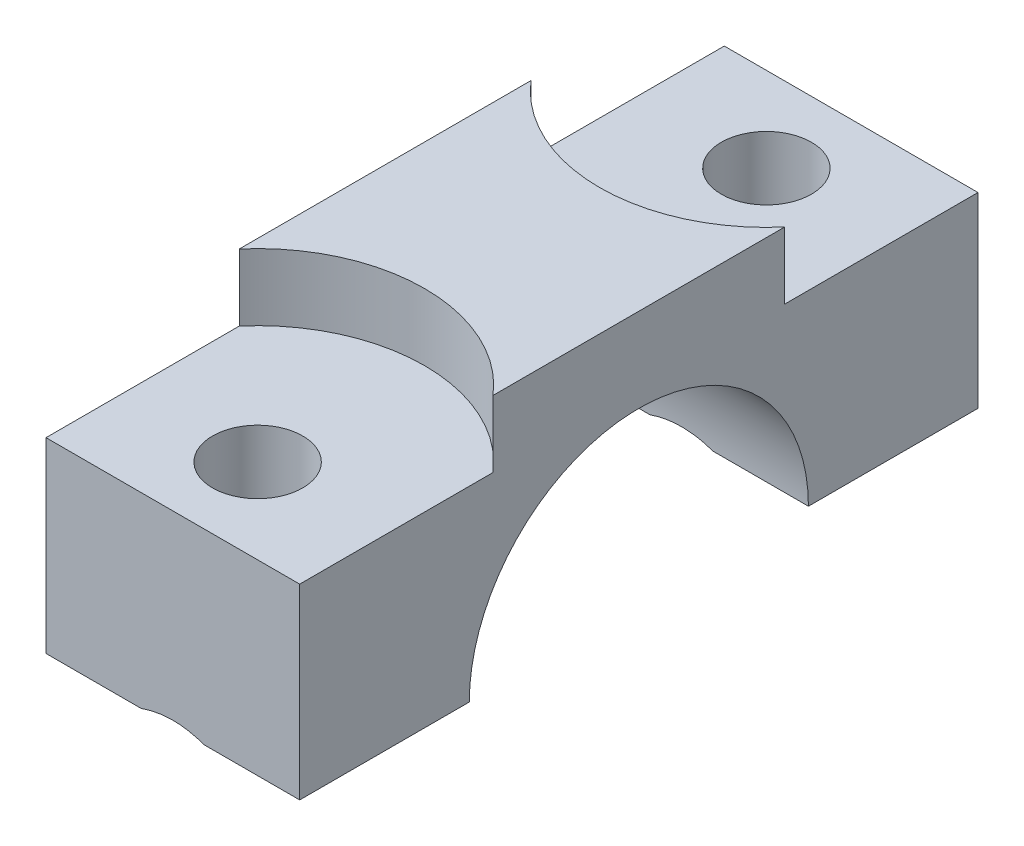
ISO-10303-21;
HEADER;
FILE_DESCRIPTION(('STEP AP214'),'2;1');
FILE_NAME('part.step','',(''),(''),'','','');
FILE_SCHEMA(('AUTOMOTIVE_DESIGN { 1 0 10303 214 1 1 1 1 }'));
ENDSEC;
DATA;
#1=APPLICATION_CONTEXT('core data for automotive mechanical design processes');
#2=APPLICATION_PROTOCOL_DEFINITION('international standard','automotive_design',2000,#1);
#3=PRODUCT_CONTEXT('',#1,'mechanical');
#4=PRODUCT('Part','Part','',(#3));
#5=PRODUCT_RELATED_PRODUCT_CATEGORY('part','',(#4));
#6=PRODUCT_DEFINITION_FORMATION('','',#4);
#7=PRODUCT_DEFINITION_CONTEXT('part definition',#1,'design');
#8=PRODUCT_DEFINITION('design','',#6,#7);
#9=PRODUCT_DEFINITION_SHAPE('','',#8);
#10=(LENGTH_UNIT() NAMED_UNIT(*) SI_UNIT(.MILLI.,.METRE.));
#11=(NAMED_UNIT(*) PLANE_ANGLE_UNIT() SI_UNIT($,.RADIAN.));
#12=(NAMED_UNIT(*) SI_UNIT($,.STERADIAN.) SOLID_ANGLE_UNIT());
#13=UNCERTAINTY_MEASURE_WITH_UNIT(LENGTH_MEASURE(1.E-05),#10,'distance_accuracy_value','');
#14=(GEOMETRIC_REPRESENTATION_CONTEXT(3) GLOBAL_UNCERTAINTY_ASSIGNED_CONTEXT((#13)) GLOBAL_UNIT_ASSIGNED_CONTEXT((#10,
#11,#12)) REPRESENTATION_CONTEXT('',''));
#15=CARTESIAN_POINT('',(0.,0.,0.));
#16=DIRECTION('',(0.,0.,1.));
#17=DIRECTION('',(1.,0.,0.));
#18=AXIS2_PLACEMENT_3D('',#15,#16,#17);
#19=CARTESIAN_POINT('',(9.5,0.,0.));
#20=DIRECTION('',(0.,1.,0.));
#21=DIRECTION('',(0.,0.,1.));
#22=AXIS2_PLACEMENT_3D('',#19,#20,#21);
#23=PLANE('',#22);
#24=DIRECTION('',(-1.,0.,0.));
#25=VECTOR('',#24,1.);
#26=CARTESIAN_POINT('',(9.5,0.,-12.7));
#27=LINE('',#26,#25);
#28=CARTESIAN_POINT('',(9.5,0.,-12.7));
#29=VERTEX_POINT('',#28);
#30=CARTESIAN_POINT('',(2.36180545346139,0.,-12.7));
#31=VERTEX_POINT('',#30);
#32=EDGE_CURVE('E235',#29,#31,#27,.T.);
#33=ORIENTED_EDGE('',*,*,#32,.T.);
#34=CARTESIAN_POINT('',(0.,0.,-19.05));
#35=DIRECTION('',(0.,1.,0.));
#36=DIRECTION('',(0.,0.,1.));
#37=AXIS2_PLACEMENT_3D('',#34,#35,#36);
#38=CIRCLE('',#37,6.775);
#39=CARTESIAN_POINT('',(2.36180545346138,0.,-25.4));
#40=VERTEX_POINT('',#39);
#41=EDGE_CURVE('E337',#31,#40,#38,.T.);
#42=ORIENTED_EDGE('',*,*,#41,.T.);
#43=DIRECTION('',(-1.,0.,0.));
#44=VECTOR('',#43,1.);
#45=CARTESIAN_POINT('',(9.5,0.,-25.4));
#46=LINE('',#45,#44);
#47=CARTESIAN_POINT('',(9.5,0.,-25.4));
#48=VERTEX_POINT('',#47);
#49=EDGE_CURVE('E231',#48,#40,#46,.T.);
#50=ORIENTED_EDGE('',*,*,#49,.F.);
#51=DIRECTION('',(0.,0.,-1.));
#52=VECTOR('',#51,1.);
#53=CARTESIAN_POINT('',(9.5,0.,0.));
#54=LINE('',#53,#52);
#55=EDGE_CURVE('E199',#29,#48,#54,.T.);
#56=ORIENTED_EDGE('',*,*,#55,.F.);
#57=EDGE_LOOP('',(#33,#42,#50,#56));
#58=FACE_BOUND('',#57,.T.);
#59=ADVANCED_FACE('F33',(#58),#23,.F.);
#60=DIRECTION('',(-1.,0.,0.));
#61=VECTOR('',#60,1.);
#62=CARTESIAN_POINT('',(9.5,0.,25.4));
#63=LINE('',#62,#61);
#64=CARTESIAN_POINT('',(9.5,0.,25.4));
#65=VERTEX_POINT('',#64);
#66=CARTESIAN_POINT('',(2.3618054534614,0.,25.4));
#67=VERTEX_POINT('',#66);
#68=EDGE_CURVE('E227',#65,#67,#63,.T.);
#69=ORIENTED_EDGE('',*,*,#68,.T.);
#70=CARTESIAN_POINT('',(0.,0.,19.05));
#71=DIRECTION('',(0.,1.,0.));
#72=DIRECTION('',(0.,0.,1.));
#73=AXIS2_PLACEMENT_3D('',#70,#71,#72);
#74=CIRCLE('',#73,6.775);
#75=CARTESIAN_POINT('',(2.36180545346139,0.,12.7));
#76=VERTEX_POINT('',#75);
#77=EDGE_CURVE('E269',#67,#76,#74,.T.);
#78=ORIENTED_EDGE('',*,*,#77,.T.);
#79=DIRECTION('',(-1.,0.,0.));
#80=VECTOR('',#79,1.);
#81=CARTESIAN_POINT('',(9.5,0.,12.7));
#82=LINE('',#81,#80);
#83=CARTESIAN_POINT('',(9.5,0.,12.7));
#84=VERTEX_POINT('',#83);
#85=EDGE_CURVE('E222',#84,#76,#82,.T.);
#86=ORIENTED_EDGE('',*,*,#85,.F.);
#87=EDGE_CURVE('E202',#65,#84,#54,.T.);
#88=ORIENTED_EDGE('',*,*,#87,.F.);
#89=EDGE_LOOP('',(#69,#78,#86,#88));
#90=FACE_BOUND('',#89,.T.);
#91=ADVANCED_FACE('F297',(#90),#23,.F.);
#92=CARTESIAN_POINT('',(9.5,0.,0.));
#93=DIRECTION('',(-1.,0.,0.));
#94=DIRECTION('',(0.,0.,1.));
#95=AXIS2_PLACEMENT_3D('',#92,#93,#94);
#96=CYLINDRICAL_SURFACE('',#95,12.7);
#97=CARTESIAN_POINT('',(3.20088610634259,-0.340199999999996,-12.695442645296));
#98=CARTESIAN_POINT('',(2.98760367423764,-0.241873493435762,-12.6980814298224));
#99=CARTESIAN_POINT('',(2.77075334441911,-0.150734277663432,-12.6993732807779));
#100=CARTESIAN_POINT('',(2.33001667964961,0.0143484953978662,-12.7002605537787));
#101=CARTESIAN_POINT('',(2.1061141253969,0.0882485395777557,-12.6998517310824));
#102=CARTESIAN_POINT('',(1.6540447186778,0.215061497088232,-12.6983372365348));
#103=CARTESIAN_POINT('',(1.42591908954484,0.26811878135838,-12.6972365007729));
#104=CARTESIAN_POINT('',(0.965686859090227,0.351233023819484,-12.6952112601035));
#105=CARTESIAN_POINT('',(0.733584442182601,0.381312801883203,-12.6942865810343));
#106=CARTESIAN_POINT('',(0.2769775563334,0.41606829770035,-12.6931942628909));
#107=CARTESIAN_POINT('',(0.0525488971303182,0.421729292811496,-12.6929973095901));
#108=CARTESIAN_POINT('',(-0.395770159041613,0.410016895435441,-12.6933808936333));
#109=CARTESIAN_POINT('',(-0.619660364442378,0.392636255146701,-12.6939616756164));
#110=CARTESIAN_POINT('',(-1.06450974648838,0.335822541414968,-12.6955902659321));
#111=CARTESIAN_POINT('',(-1.28546975710559,0.296395886716365,-12.6966379383105));
#112=CARTESIAN_POINT('',(-1.72275436294014,0.197516578643697,-12.6985594524727));
#113=CARTESIAN_POINT('',(-1.93908007376723,0.13806880388185,-12.6994333365216));
#114=CARTESIAN_POINT('',(-2.33169605142416,0.0126854476301309,-12.7001217882707));
#115=CARTESIAN_POINT('',(-2.50882664672544,-0.0506663829319185,-12.7000842013808));
#116=CARTESIAN_POINT('',(-2.85832472522239,-0.187907663557629,-12.6987953478512));
#117=CARTESIAN_POINT('',(-3.0307054252539,-0.261763379600662,-12.6975478948979));
#118=CARTESIAN_POINT('',(-3.20088610634259,-0.340199999999996,-12.695442645296));
#119=B_SPLINE_CURVE_WITH_KNOTS('',3,(#97,#98,#99,#100,#101,#102,#103,#104,#105,#106,#107,#108,
#109,#110,#111,#112,#113,#114,#115,#116,#117,#118),.UNSPECIFIED.,.F.,.F.,(4,2,2,2,2,2,2,2,2,2,
4),(0.,0.704801530635854,1.41136324202494,2.11294069334842,2.81382047113446,3.48613905439842,
4.15866916726724,4.83100357343024,5.50317426804884,6.06717090407667,6.62939549359292),.UNSPECIFIED.);
#120=CARTESIAN_POINT('',(-2.36180545346139,0.,-12.7));
#121=VERTEX_POINT('',#120);
#122=EDGE_CURVE('E273',#31,#121,#119,.T.);
#123=ORIENTED_EDGE('',*,*,#122,.F.);
#124=ORIENTED_EDGE('',*,*,#32,.F.);
#125=CARTESIAN_POINT('',(9.5,0.,0.));
#126=DIRECTION('',(1.,0.,0.));
#127=DIRECTION('',(0.,0.,-1.));
#128=AXIS2_PLACEMENT_3D('',#125,#126,#127);
#129=CIRCLE('',#128,12.7);
#130=EDGE_CURVE('E196',#29,#84,#129,.T.);
#131=ORIENTED_EDGE('',*,*,#130,.T.);
#132=ORIENTED_EDGE('',*,*,#85,.T.);
#133=CARTESIAN_POINT('',(-3.2008861063426,-0.340199999999996,12.695442645296));
#134=CARTESIAN_POINT('',(-2.98760367423765,-0.241873493435761,12.6980814298224));
#135=CARTESIAN_POINT('',(-2.77075334441912,-0.15073427766343,12.6993732807779));
#136=CARTESIAN_POINT('',(-2.33001667964962,0.0143484953978683,12.7002605537787));
#137=CARTESIAN_POINT('',(-2.10611412539691,0.0882485395777574,12.6998517310824));
#138=CARTESIAN_POINT('',(-1.6540447186778,0.215061497088235,12.6983372365348));
#139=CARTESIAN_POINT('',(-1.42591908954485,0.268118781358385,12.6972365007729));
#140=CARTESIAN_POINT('',(-0.965686859090232,0.351233023819489,12.6952112601035));
#141=CARTESIAN_POINT('',(-0.733584442182605,0.381312801883207,12.6942865810343));
#142=CARTESIAN_POINT('',(-0.276977556333404,0.416068297700354,12.6931942628909));
#143=CARTESIAN_POINT('',(-0.0525488971303222,0.421729292811501,12.6929973095901));
#144=CARTESIAN_POINT('',(0.395770159041609,0.410016895435447,12.6933808936333));
#145=CARTESIAN_POINT('',(0.619660364442374,0.392636255146706,12.6939616756164));
#146=CARTESIAN_POINT('',(1.06450974648838,0.335822541414974,12.6955902659321));
#147=CARTESIAN_POINT('',(1.28546975710559,0.296395886716372,12.6966379383105));
#148=CARTESIAN_POINT('',(1.72275436294013,0.197516578643703,12.6985594524727));
#149=CARTESIAN_POINT('',(1.93908007376723,0.138068803881855,12.6994333365216));
#150=CARTESIAN_POINT('',(2.33169605142416,0.0126854476301337,12.7001217882707));
#151=CARTESIAN_POINT('',(2.50882664672544,-0.0506663829319159,12.7000842013808));
#152=CARTESIAN_POINT('',(2.85832472522239,-0.187907663557627,12.6987953478512));
#153=CARTESIAN_POINT('',(3.03070542525391,-0.26176337960066,12.6975478948979));
#154=CARTESIAN_POINT('',(3.2008861063426,-0.340199999999995,12.695442645296));
#155=B_SPLINE_CURVE_WITH_KNOTS('',3,(#133,#134,#135,#136,#137,#138,#139,#140,#141,#142,#143,
#144,#145,#146,#147,#148,#149,#150,#151,#152,#153,#154),.UNSPECIFIED.,.F.,.F.,(4,2,2,2,2,2,2,2,
2,2,4),(0.,0.704801530635856,1.41136324202494,2.11294069334843,2.81382047113447,
3.48613905439842,4.15866916726724,4.83100357343025,5.50317426804885,6.06717090407668,
6.62939549359294),.UNSPECIFIED.);
#156=CARTESIAN_POINT('',(-2.36180545346139,0.,12.7));
#157=VERTEX_POINT('',#156);
#158=EDGE_CURVE('E186',#157,#76,#155,.T.);
#159=ORIENTED_EDGE('',*,*,#158,.F.);
#160=CARTESIAN_POINT('',(-9.5,0.,12.7));
#161=VERTEX_POINT('',#160);
#162=EDGE_CURVE('E226',#157,#161,#82,.T.);
#163=ORIENTED_EDGE('',*,*,#162,.T.);
#164=CARTESIAN_POINT('',(-9.5,0.,0.));
#165=DIRECTION('',(1.,0.,0.));
#166=DIRECTION('',(0.,0.,-1.));
#167=AXIS2_PLACEMENT_3D('',#164,#165,#166);
#168=CIRCLE('',#167,12.7);
#169=CARTESIAN_POINT('',(-9.5,0.,-12.7));
#170=VERTEX_POINT('',#169);
#171=EDGE_CURVE('E193',#170,#161,#168,.T.);
#172=ORIENTED_EDGE('',*,*,#171,.F.);
#173=EDGE_CURVE('E234',#121,#170,#27,.T.);
#174=ORIENTED_EDGE('',*,*,#173,.F.);
#175=EDGE_LOOP('',(#123,#124,#131,#132,#159,#163,#172,#174));
#176=FACE_BOUND('',#175,.T.);
#177=ADVANCED_FACE('F35',(#176),#96,.F.);
#178=CARTESIAN_POINT('',(-2.36180545346136,0.,-25.4));
#179=VERTEX_POINT('',#178);
#180=CARTESIAN_POINT('',(-9.5,0.,-25.4));
#181=VERTEX_POINT('',#180);
#182=EDGE_CURVE('E230',#179,#181,#46,.T.);
#183=ORIENTED_EDGE('',*,*,#182,.F.);
#184=EDGE_CURVE('E53',#179,#121,#38,.T.);
#185=ORIENTED_EDGE('',*,*,#184,.T.);
#186=ORIENTED_EDGE('',*,*,#173,.T.);
#187=DIRECTION('',(0.,0.,-1.));
#188=VECTOR('',#187,1.);
#189=CARTESIAN_POINT('',(-9.5,0.,0.));
#190=LINE('',#189,#188);
#191=EDGE_CURVE('E210',#170,#181,#190,.T.);
#192=ORIENTED_EDGE('',*,*,#191,.T.);
#193=EDGE_LOOP('',(#183,#185,#186,#192));
#194=FACE_BOUND('',#193,.T.);
#195=ADVANCED_FACE('F304',(#194),#23,.F.);
#196=CARTESIAN_POINT('',(9.5,0.,-25.4));
#197=DIRECTION('',(0.,0.,-1.));
#198=DIRECTION('',(0.,1.,0.));
#199=AXIS2_PLACEMENT_3D('',#196,#197,#198);
#200=PLANE('',#199);
#201=DIRECTION('',(-1.,0.,0.));
#202=VECTOR('',#201,1.);
#203=CARTESIAN_POINT('',(9.5,14.,-25.4));
#204=LINE('',#203,#202);
#205=CARTESIAN_POINT('',(9.5,14.,-25.4));
#206=VERTEX_POINT('',#205);
#207=CARTESIAN_POINT('',(-9.5,14.,-25.4));
#208=VERTEX_POINT('',#207);
#209=EDGE_CURVE('E328',#206,#208,#204,.T.);
#210=ORIENTED_EDGE('',*,*,#209,.F.);
#211=DIRECTION('',(0.,-1.,0.));
#212=VECTOR('',#211,1.);
#213=CARTESIAN_POINT('',(9.5,0.,-25.4));
#214=LINE('',#213,#212);
#215=EDGE_CURVE('E158',#206,#48,#214,.T.);
#216=ORIENTED_EDGE('',*,*,#215,.T.);
#217=ORIENTED_EDGE('',*,*,#49,.T.);
#218=CARTESIAN_POINT('',(-22.6091809083314,-16.7089852100459,-25.4));
#219=CARTESIAN_POINT('',(-22.0381424728746,-16.1592695939331,-25.4));
#220=CARTESIAN_POINT('',(-21.4663897410148,-15.6102920814854,-25.4));
#221=CARTESIAN_POINT('',(-20.3209361240807,-14.5143069761264,-25.4));
#222=CARTESIAN_POINT('',(-19.7472351274941,-13.9672994997956,-25.4));
#223=CARTESIAN_POINT('',(-18.5957690791975,-12.8742339209298,-25.4));
#224=CARTESIAN_POINT('',(-18.0179970723246,-12.3281831398417,-25.4));
#225=CARTESIAN_POINT('',(-16.859335872528,-11.239445466357,-25.4));
#226=CARTESIAN_POINT('',(-16.2784468198223,-10.696758424973,-25.4));
#227=CARTESIAN_POINT('',(-15.3682892354952,-9.85304424065471,-25.4));
#228=CARTESIAN_POINT('',(-15.0404566618359,-9.55046819905684,-25.4));
#229=CARTESIAN_POINT('',(-14.3832144955344,-8.94703442403581,-25.4));
#230=CARTESIAN_POINT('',(-14.0538049075323,-8.64617668556247,-25.4));
#231=CARTESIAN_POINT('',(-13.3930410534957,-8.04649768664086,-25.4));
#232=CARTESIAN_POINT('',(-13.0616864890803,-7.74767675470845,-25.4));
#233=CARTESIAN_POINT('',(-12.3966802734345,-7.1526033531331,-25.4));
#234=CARTESIAN_POINT('',(-12.0630286368779,-6.85635086711003,-25.4));
#235=CARTESIAN_POINT('',(-11.393455646251,-6.26754376625942,-25.4));
#236=CARTESIAN_POINT('',(-11.0575389768951,-5.97498383126984,-25.4));
#237=CARTESIAN_POINT('',(-10.3822037979866,-5.39393609417816,-25.4));
#238=CARTESIAN_POINT('',(-10.0427853443557,-5.1054482272208,-25.4));
#239=CARTESIAN_POINT('',(-9.35960183245717,-4.53383007475496,-25.4));
#240=CARTESIAN_POINT('',(-9.0158378811079,-4.2506984689742,-25.4));
#241=CARTESIAN_POINT('',(-8.32265032143079,-3.69146692104642,-25.4));
#242=CARTESIAN_POINT('',(-7.9732271672835,-3.41536641914674,-25.4));
#243=CARTESIAN_POINT('',(-7.41078048120579,-2.98329452669944,-25.4));
#244=CARTESIAN_POINT('',(-7.20016254335253,-2.82419367261727,-25.4));
#245=CARTESIAN_POINT('',(-6.77583080340435,-2.51014878395704,-25.4));
#246=CARTESIAN_POINT('',(-6.56211690494978,-2.35520487919112,-25.4));
#247=CARTESIAN_POINT('',(-6.13068324649388,-2.05021702085325,-25.4));
#248=CARTESIAN_POINT('',(-5.91295749372031,-1.90018151660718,-25.4));
#249=CARTESIAN_POINT('',(-5.47316614252563,-1.60660046172268,-25.4));
#250=CARTESIAN_POINT('',(-5.25110072071184,-1.46305464776411,-25.4));
#251=CARTESIAN_POINT('',(-4.8059992488934,-1.18679872855528,-25.4));
#252=CARTESIAN_POINT('',(-4.58305794911609,-1.05393681721026,-25.4));
#253=CARTESIAN_POINT('',(-4.13132536821679,-0.798351213764125,-25.4));
#254=CARTESIAN_POINT('',(-3.9025328007737,-0.675629776435825,-25.4));
#255=CARTESIAN_POINT('',(-3.43893780551462,-0.443630272898643,-25.4));
#256=CARTESIAN_POINT('',(-3.2041532131289,-0.334316908496938,-25.4));
#257=CARTESIAN_POINT('',(-2.72749304080943,-0.132616678754333,-25.4));
#258=CARTESIAN_POINT('',(-2.48562262790411,-0.0402178189175793,-25.4));
#259=CARTESIAN_POINT('',(-2.04671193123374,0.105795970675969,-25.4));
#260=CARTESIAN_POINT('',(-1.85103478849335,0.16348034272983,-25.4));
#261=CARTESIAN_POINT('',(-1.45564968703864,0.263099287319895,-25.4));
#262=CARTESIAN_POINT('',(-1.25594176726091,0.305034011918226,-25.4));
#263=CARTESIAN_POINT('',(-0.854611852687361,0.370788923336921,-25.4));
#264=CARTESIAN_POINT('',(-0.653005723219897,0.394704424859444,-25.4));
#265=CARTESIAN_POINT('',(-0.248423757326053,0.423344620800914,-25.4));
#266=CARTESIAN_POINT('',(-0.0454480299724827,0.428070825774151,-25.4));
#267=CARTESIAN_POINT('',(0.355383292502386,0.418148661804222,-25.4));
#268=CARTESIAN_POINT('',(0.553250095938918,0.403939649448441,-25.4));
#269=CARTESIAN_POINT('',(0.946879760246198,0.357769237916375,-25.4));
#270=CARTESIAN_POINT('',(1.14264248671306,0.325806711473438,-25.4));
#271=CARTESIAN_POINT('',(1.53189607797543,0.245628073415185,-25.4));
#272=CARTESIAN_POINT('',(1.72536826400057,0.197322596064968,-25.4));
#273=CARTESIAN_POINT('',(2.10821889255385,0.0866911807344114,-25.4));
#274=CARTESIAN_POINT('',(2.29759707265585,0.0243643468875109,-25.4));
#275=CARTESIAN_POINT('',(2.70243509866064,-0.123155932574649,-25.4));
#276=CARTESIAN_POINT('',(2.91713492272167,-0.210419202106553,-25.4));
#277=CARTESIAN_POINT('',(3.34092758502307,-0.397735562058313,-25.4));
#278=CARTESIAN_POINT('',(3.55001776811856,-0.497794584100242,-25.4));
#279=CARTESIAN_POINT('',(3.9633466199688,-0.708242971406178,-25.4));
#280=CARTESIAN_POINT('',(4.16757630716424,-0.818649841792612,-25.4));
#281=CARTESIAN_POINT('',(4.57138095886084,-1.04755507685742,-25.4));
#282=CARTESIAN_POINT('',(4.77095658102846,-1.16605228887905,-25.4));
#283=CARTESIAN_POINT('',(5.16873409534013,-1.41117458167123,-25.4));
#284=CARTESIAN_POINT('',(5.36688171991548,-1.53788731604389,-25.4));
#285=CARTESIAN_POINT('',(5.75962398781757,-1.79669527455095,-25.4));
#286=CARTESIAN_POINT('',(5.9542185324218,-1.92879064791367,-25.4));
#287=CARTESIAN_POINT('',(6.34014303802018,-2.19721926359186,-25.4));
#288=CARTESIAN_POINT('',(6.53147628501685,-2.33354779523622,-25.4));
#289=CARTESIAN_POINT('',(6.91151091502576,-2.60979978789076,-25.4));
#290=CARTESIAN_POINT('',(7.10021240740191,-2.74972309882719,-25.4));
#291=CARTESIAN_POINT('',(7.52325545632233,-3.06867417884887,-25.4));
#292=CARTESIAN_POINT('',(7.7569467346428,-3.2485634790198,-25.4));
#293=CARTESIAN_POINT('',(8.22136694512628,-3.61213244368117,-25.4));
#294=CARTESIAN_POINT('',(8.45209577199807,-3.79581224229159,-25.4));
#295=CARTESIAN_POINT('',(8.91109164558714,-4.16628382705952,-25.4));
#296=CARTESIAN_POINT('',(9.13935833919859,-4.35307605006022,-25.4));
#297=CARTESIAN_POINT('',(9.59378092107858,-4.7292129757031,-25.4));
#298=CARTESIAN_POINT('',(9.81993677937787,-4.9185577144924,-25.4));
#299=CARTESIAN_POINT('',(10.4959405162507,-5.48995028382285,-25.4));
#300=CARTESIAN_POINT('',(10.943102351554,-5.87517569416005,-25.4));
#301=CARTESIAN_POINT('',(11.8321462852682,-6.65167132500793,-25.4));
#302=CARTESIAN_POINT('',(12.274028238072,-7.04294171154605,-25.4));
#303=CARTESIAN_POINT('',(12.9343348980119,-7.63367391341266,-25.4));
#304=CARTESIAN_POINT('',(13.1542692192387,-7.83145208088894,-25.4));
#305=CARTESIAN_POINT('',(13.5932412207385,-8.2279942958457,-25.4));
#306=CARTESIAN_POINT('',(13.812278914593,-8.42675832829143,-25.4));
#307=CARTESIAN_POINT('',(14.4682254359084,-9.02435016999853,-25.4));
#308=CARTESIAN_POINT('',(14.9039581155598,-9.42446912614834,-25.4));
#309=CARTESIAN_POINT('',(15.7728105028356,-10.2272496973334,-25.4));
#310=CARTESIAN_POINT('',(16.2059310088638,-10.6299104494979,-25.4));
#311=CARTESIAN_POINT('',(17.0701847468444,-11.4373589543625,-25.4));
#312=CARTESIAN_POINT('',(17.5013179759687,-11.8421467100878,-25.4));
#313=CARTESIAN_POINT('',(18.6846550737405,-12.9575964846741,-25.4));
#314=CARTESIAN_POINT('',(19.435200055449,-13.6700178854278,-25.4));
#315=CARTESIAN_POINT('',(20.932828090807,-15.0986268992994,-25.4));
#316=CARTESIAN_POINT('',(21.6799108078496,-15.8148148647347,-25.4));
#317=CARTESIAN_POINT('',(23.1684491503871,-17.2470440357442,-25.4));
#318=CARTESIAN_POINT('',(23.909915325278,-17.9630742819124,-25.4));
#319=CARTESIAN_POINT('',(25.0205774790363,-19.0386267780747,-25.4));
#320=CARTESIAN_POINT('',(25.3905223728101,-19.3973763398422,-25.4));
#321=CARTESIAN_POINT('',(26.1299685858727,-20.1153317386533,-25.4));
#322=CARTESIAN_POINT('',(26.4994699055215,-20.4745375753261,-25.4));
#323=CARTESIAN_POINT('',(26.868777518721,-20.8339424888118,-25.4));
#324=B_SPLINE_CURVE_WITH_KNOTS('',3,(#218,#219,#220,#221,#222,#223,#224,#225,#226,#227,#228,
#229,#230,#231,#232,#233,#234,#235,#236,#237,#238,#239,#240,#241,#242,#243,#244,#245,#246,#247,
#248,#249,#250,#251,#252,#253,#254,#255,#256,#257,#258,#259,#260,#261,#262,#263,#264,#265,#266,
#267,#268,#269,#270,#271,#272,#273,#274,#275,#276,#277,#278,#279,#280,#281,#282,#283,#284,#285,
#286,#287,#288,#289,#290,#291,#292,#293,#294,#295,#296,#297,#298,#299,#300,#301,#302,#303,#304,
#305,#306,#307,#308,#309,#310,#311,#312,#313,#314,#315,#316,#317,#318,#319,#320,#321,#322,#323),
.UNSPECIFIED.,.F.,.F.,(4,2,2,2,2,2,2,2,2,2,2,2,2,2,2,2,2,2,2,2,2,2,2,2,2,2,2,2,2,2,2,2,2,2,2,2,
2,2,2,2,2,2,2,2,2,2,2,2,2,2,2,2,4),(0.,2.37791208720317,4.7559626526983,7.14089104411817,
9.525713036003,10.8640797162507,12.2024424609374,13.5410161907954,14.8795813776776,
16.2159255083136,17.5522483311138,18.8882373532642,20.2241196814726,21.0159493773324,
21.80780377153,22.6009563191748,23.3940766556002,24.1724560586064,24.9510080740737,
25.7274643503442,26.5033678710324,27.1148268424155,27.7262799100383,28.334475471679,
28.9426231560968,29.5369027506635,30.1312200835708,30.728841218169,31.3265005474259,
32.0212377941036,32.7162982698382,33.4125565428398,34.1087158238815,34.8142061024519,
35.5197159533648,36.2244670208942,36.9291887143441,37.8138673118018,38.698577265878,
39.5834124569035,40.4682601916028,42.2388148570016,44.0094182380761,44.8967632522091,
45.7840947753927,47.5587964539709,49.3329250002463,51.1070560705021,54.2115098392258,
57.3162593492295,60.4085413313187,61.954517845971,63.5004931051479),.UNSPECIFIED.);
#325=EDGE_CURVE('E11',#179,#40,#324,.T.);
#326=ORIENTED_EDGE('',*,*,#325,.F.);
#327=ORIENTED_EDGE('',*,*,#182,.T.);
#328=DIRECTION('',(0.,-1.,0.));
#329=VECTOR('',#328,1.);
#330=CARTESIAN_POINT('',(-9.5,0.,-25.4));
#331=LINE('',#330,#329);
#332=EDGE_CURVE('E213',#208,#181,#331,.T.);
#333=ORIENTED_EDGE('',*,*,#332,.F.);
#334=EDGE_LOOP('',(#210,#216,#217,#326,#327,#333));
#335=FACE_BOUND('',#334,.T.);
#336=ADVANCED_FACE('F314',(#335),#200,.T.);
#337=CARTESIAN_POINT('',(9.5,19.,0.));
#338=DIRECTION('',(0.,1.,0.));
#339=DIRECTION('',(0.,0.,1.));
#340=AXIS2_PLACEMENT_3D('',#337,#338,#339);
#341=PLANE('',#340);
#342=CARTESIAN_POINT('',(0.,19.,-19.05));
#343=DIRECTION('',(0.,1.,0.));
#344=DIRECTION('',(0.,0.,1.));
#345=AXIS2_PLACEMENT_3D('',#342,#343,#344);
#346=CIRCLE('',#345,12.5);
#347=CARTESIAN_POINT('',(-9.5,19.,-10.925961595364));
#348=VERTEX_POINT('',#347);
#349=CARTESIAN_POINT('',(9.5,19.,-10.925961595364));
#350=VERTEX_POINT('',#349);
#351=EDGE_CURVE('E61',#348,#350,#346,.T.);
#352=ORIENTED_EDGE('',*,*,#351,.F.);
#353=DIRECTION('',(0.,0.,-1.));
#354=VECTOR('',#353,1.);
#355=CARTESIAN_POINT('',(-9.5,19.,0.));
#356=LINE('',#355,#354);
#357=CARTESIAN_POINT('',(-9.5,19.,10.925961595364));
#358=VERTEX_POINT('',#357);
#359=EDGE_CURVE('E216',#358,#348,#356,.T.);
#360=ORIENTED_EDGE('',*,*,#359,.F.);
#361=CARTESIAN_POINT('',(0.,19.,19.05));
#362=DIRECTION('',(0.,1.,0.));
#363=DIRECTION('',(0.,0.,1.));
#364=AXIS2_PLACEMENT_3D('',#361,#362,#363);
#365=CIRCLE('',#364,12.5);
#366=CARTESIAN_POINT('',(9.5,19.,10.925961595364));
#367=VERTEX_POINT('',#366);
#368=EDGE_CURVE('E267',#367,#358,#365,.T.);
#369=ORIENTED_EDGE('',*,*,#368,.F.);
#370=DIRECTION('',(0.,0.,-1.));
#371=VECTOR('',#370,1.);
#372=CARTESIAN_POINT('',(9.5,19.,0.));
#373=LINE('',#372,#371);
#374=EDGE_CURVE('E204',#367,#350,#373,.T.);
#375=ORIENTED_EDGE('',*,*,#374,.T.);
#376=EDGE_LOOP('',(#352,#360,#369,#375));
#377=FACE_BOUND('',#376,.T.);
#378=ADVANCED_FACE('F311',(#377),#341,.T.);
#379=CARTESIAN_POINT('',(9.5,0.,25.4));
#380=DIRECTION('',(0.,0.,-1.));
#381=DIRECTION('',(0.,1.,0.));
#382=AXIS2_PLACEMENT_3D('',#379,#380,#381);
#383=PLANE('',#382);
#384=DIRECTION('',(0.,-1.,0.));
#385=VECTOR('',#384,1.);
#386=CARTESIAN_POINT('',(9.5,0.,25.4));
#387=LINE('',#386,#385);
#388=CARTESIAN_POINT('',(9.5,14.,25.4));
#389=VERTEX_POINT('',#388);
#390=EDGE_CURVE('E206',#389,#65,#387,.T.);
#391=ORIENTED_EDGE('',*,*,#390,.F.);
#392=DIRECTION('',(-1.,0.,0.));
#393=VECTOR('',#392,1.);
#394=CARTESIAN_POINT('',(9.5,14.,25.4));
#395=LINE('',#394,#393);
#396=CARTESIAN_POINT('',(-9.5,14.,25.4));
#397=VERTEX_POINT('',#396);
#398=EDGE_CURVE('E249',#389,#397,#395,.T.);
#399=ORIENTED_EDGE('',*,*,#398,.T.);
#400=DIRECTION('',(0.,-1.,0.));
#401=VECTOR('',#400,1.);
#402=CARTESIAN_POINT('',(-9.5,0.,25.4));
#403=LINE('',#402,#401);
#404=CARTESIAN_POINT('',(-9.5,0.,25.4));
#405=VERTEX_POINT('',#404);
#406=EDGE_CURVE('E219',#397,#405,#403,.T.);
#407=ORIENTED_EDGE('',*,*,#406,.T.);
#408=CARTESIAN_POINT('',(-2.36180545346138,0.,25.4));
#409=VERTEX_POINT('',#408);
#410=EDGE_CURVE('E225',#409,#405,#63,.T.);
#411=ORIENTED_EDGE('',*,*,#410,.F.);
#412=CARTESIAN_POINT('',(-22.6091809083315,-16.7089852100459,25.4));
#413=CARTESIAN_POINT('',(-22.0381424728746,-16.1592695939331,25.4));
#414=CARTESIAN_POINT('',(-21.4663897410149,-15.6102920814854,25.4));
#415=CARTESIAN_POINT('',(-20.3209361240807,-14.5143069761264,25.4));
#416=CARTESIAN_POINT('',(-19.7472351274941,-13.9672994997956,25.4));
#417=CARTESIAN_POINT('',(-18.5957690791975,-12.8742339209298,25.4));
#418=CARTESIAN_POINT('',(-18.0179970723246,-12.3281831398417,25.4));
#419=CARTESIAN_POINT('',(-16.8593358725281,-11.2394454663571,25.4));
#420=CARTESIAN_POINT('',(-16.2784468198224,-10.696758424973,25.4));
#421=CARTESIAN_POINT('',(-15.3682892354952,-9.85304424065472,25.4));
#422=CARTESIAN_POINT('',(-15.0404566618359,-9.55046819905685,25.4));
#423=CARTESIAN_POINT('',(-14.3832144955344,-8.94703442403583,25.4));
#424=CARTESIAN_POINT('',(-14.0538049075323,-8.64617668556249,25.4));
#425=CARTESIAN_POINT('',(-13.3930410534958,-8.04649768664088,25.4));
#426=CARTESIAN_POINT('',(-13.0616864890804,-7.74767675470846,25.4));
#427=CARTESIAN_POINT('',(-12.3966802734345,-7.15260335313311,25.4));
#428=CARTESIAN_POINT('',(-12.0630286368779,-6.85635086711004,25.4));
#429=CARTESIAN_POINT('',(-11.393455646251,-6.26754376625943,25.4));
#430=CARTESIAN_POINT('',(-11.0575389768952,-5.97498383126984,25.4));
#431=CARTESIAN_POINT('',(-10.3822037979866,-5.39393609417817,25.4));
#432=CARTESIAN_POINT('',(-10.0427853443557,-5.10544822722081,25.4));
#433=CARTESIAN_POINT('',(-9.35960183245719,-4.53383007475497,25.4));
#434=CARTESIAN_POINT('',(-9.01583788110792,-4.25069846897421,25.4));
#435=CARTESIAN_POINT('',(-8.3226503214308,-3.69146692104643,25.4));
#436=CARTESIAN_POINT('',(-7.97322716728352,-3.41536641914674,25.4));
#437=CARTESIAN_POINT('',(-7.41078048120581,-2.98329452669945,25.4));
#438=CARTESIAN_POINT('',(-7.20016254335254,-2.82419367261728,25.4));
#439=CARTESIAN_POINT('',(-6.77583080340437,-2.51014878395705,25.4));
#440=CARTESIAN_POINT('',(-6.5621169049498,-2.35520487919112,25.4));
#441=CARTESIAN_POINT('',(-6.13068324649389,-2.05021702085325,25.4));
#442=CARTESIAN_POINT('',(-5.91295749372032,-1.90018151660718,25.4));
#443=CARTESIAN_POINT('',(-5.47316614252565,-1.60660046172268,25.4));
#444=CARTESIAN_POINT('',(-5.25110072071185,-1.4630546477641,25.4));
#445=CARTESIAN_POINT('',(-4.80599924889342,-1.18679872855528,25.4));
#446=CARTESIAN_POINT('',(-4.5830579491161,-1.05393681721025,25.4));
#447=CARTESIAN_POINT('',(-4.1313253682168,-0.798351213764119,25.4));
#448=CARTESIAN_POINT('',(-3.90253280077371,-0.675629776435818,25.4));
#449=CARTESIAN_POINT('',(-3.43893780551463,-0.443630272898635,25.4));
#450=CARTESIAN_POINT('',(-3.2041532131289,-0.33431690849693,25.4));
#451=CARTESIAN_POINT('',(-2.72749304080943,-0.132616678754325,25.4));
#452=CARTESIAN_POINT('',(-2.48562262790411,-0.0402178189175698,25.4));
#453=CARTESIAN_POINT('',(-2.04671193123374,0.10579597067598,25.4));
#454=CARTESIAN_POINT('',(-1.85103478849335,0.163480342729841,25.4));
#455=CARTESIAN_POINT('',(-1.45564968703864,0.263099287319905,25.4));
#456=CARTESIAN_POINT('',(-1.25594176726091,0.305034011918235,25.4));
#457=CARTESIAN_POINT('',(-0.854611852687363,0.370788923336929,25.4));
#458=CARTESIAN_POINT('',(-0.653005723219898,0.394704424859452,25.4));
#459=CARTESIAN_POINT('',(-0.248423757326054,0.423344620800922,25.4));
#460=CARTESIAN_POINT('',(-0.0454480299724846,0.428070825774159,25.4));
#461=CARTESIAN_POINT('',(0.355383292502384,0.418148661804231,25.4));
#462=CARTESIAN_POINT('',(0.553250095938916,0.40393964944845,25.4));
#463=CARTESIAN_POINT('',(0.946879760246196,0.357769237916384,25.4));
#464=CARTESIAN_POINT('',(1.14264248671306,0.325806711473446,25.4));
#465=CARTESIAN_POINT('',(1.53189607797543,0.245628073415195,25.4));
#466=CARTESIAN_POINT('',(1.72536826400056,0.197322596064979,25.4));
#467=CARTESIAN_POINT('',(2.10821889255385,0.0866911807344238,25.4));
#468=CARTESIAN_POINT('',(2.29759707265585,0.0243643468875222,25.4));
#469=CARTESIAN_POINT('',(2.70243509866064,-0.123155932574639,25.4));
#470=CARTESIAN_POINT('',(2.91713492272167,-0.210419202106543,25.4));
#471=CARTESIAN_POINT('',(3.34092758502308,-0.397735562058305,25.4));
#472=CARTESIAN_POINT('',(3.55001776811857,-0.497794584100235,25.4));
#473=CARTESIAN_POINT('',(3.96334661996881,-0.708242971406172,25.4));
#474=CARTESIAN_POINT('',(4.16757630716425,-0.818649841792605,25.4));
#475=CARTESIAN_POINT('',(4.57138095886084,-1.04755507685741,25.4));
#476=CARTESIAN_POINT('',(4.77095658102846,-1.16605228887905,25.4));
#477=CARTESIAN_POINT('',(5.16873409534013,-1.41117458167122,25.4));
#478=CARTESIAN_POINT('',(5.36688171991549,-1.53788731604389,25.4));
#479=CARTESIAN_POINT('',(5.75962398781757,-1.79669527455095,25.4));
#480=CARTESIAN_POINT('',(5.95421853242181,-1.92879064791366,25.4));
#481=CARTESIAN_POINT('',(6.34014303802019,-2.19721926359186,25.4));
#482=CARTESIAN_POINT('',(6.53147628501685,-2.33354779523621,25.4));
#483=CARTESIAN_POINT('',(6.91151091502577,-2.60979978789076,25.4));
#484=CARTESIAN_POINT('',(7.10021240740191,-2.74972309882718,25.4));
#485=CARTESIAN_POINT('',(7.52325545632234,-3.06867417884887,25.4));
#486=CARTESIAN_POINT('',(7.75694673464281,-3.2485634790198,25.4));
#487=CARTESIAN_POINT('',(8.22136694512629,-3.61213244368117,25.4));
#488=CARTESIAN_POINT('',(8.45209577199808,-3.79581224229159,25.4));
#489=CARTESIAN_POINT('',(8.91109164558716,-4.16628382705953,25.4));
#490=CARTESIAN_POINT('',(9.13935833919861,-4.35307605006023,25.4));
#491=CARTESIAN_POINT('',(9.5937809210786,-4.7292129757031,25.4));
#492=CARTESIAN_POINT('',(9.81993677937789,-4.9185577144924,25.4));
#493=CARTESIAN_POINT('',(10.4959405162507,-5.48995028382285,25.4));
#494=CARTESIAN_POINT('',(10.9431023515541,-5.87517569416005,25.4));
#495=CARTESIAN_POINT('',(11.8321462852682,-6.65167132500793,25.4));
#496=CARTESIAN_POINT('',(12.274028238072,-7.04294171154605,25.4));
#497=CARTESIAN_POINT('',(12.9343348980119,-7.63367391341265,25.4));
#498=CARTESIAN_POINT('',(13.1542692192387,-7.83145208088893,25.4));
#499=CARTESIAN_POINT('',(13.5932412207385,-8.2279942958457,25.4));
#500=CARTESIAN_POINT('',(13.812278914593,-8.42675832829143,25.4));
#501=CARTESIAN_POINT('',(14.4682254359084,-9.02435016999853,25.4));
#502=CARTESIAN_POINT('',(14.9039581155598,-9.42446912614834,25.4));
#503=CARTESIAN_POINT('',(15.7728105028356,-10.2272496973334,25.4));
#504=CARTESIAN_POINT('',(16.2059310088638,-10.6299104494979,25.4));
#505=CARTESIAN_POINT('',(17.0701847468444,-11.4373589543625,25.4));
#506=CARTESIAN_POINT('',(17.5013179759687,-11.8421467100878,25.4));
#507=CARTESIAN_POINT('',(18.6846550737406,-12.9575964846741,25.4));
#508=CARTESIAN_POINT('',(19.435200055449,-13.6700178854278,25.4));
#509=CARTESIAN_POINT('',(20.932828090807,-15.0986268992994,25.4));
#510=CARTESIAN_POINT('',(21.6799108078497,-15.8148148647347,25.4));
#511=CARTESIAN_POINT('',(23.1684491503871,-17.2470440357442,25.4));
#512=CARTESIAN_POINT('',(23.909915325278,-17.9630742819124,25.4));
#513=CARTESIAN_POINT('',(25.0205774790364,-19.0386267780747,25.4));
#514=CARTESIAN_POINT('',(25.3905223728101,-19.3973763398422,25.4));
#515=CARTESIAN_POINT('',(26.1299685858727,-20.1153317386533,25.4));
#516=CARTESIAN_POINT('',(26.4994699055215,-20.4745375753261,25.4));
#517=CARTESIAN_POINT('',(26.868777518721,-20.8339424888118,25.4));
#518=B_SPLINE_CURVE_WITH_KNOTS('',3,(#412,#413,#414,#415,#416,#417,#418,#419,#420,#421,#422,
#423,#424,#425,#426,#427,#428,#429,#430,#431,#432,#433,#434,#435,#436,#437,#438,#439,#440,#441,
#442,#443,#444,#445,#446,#447,#448,#449,#450,#451,#452,#453,#454,#455,#456,#457,#458,#459,#460,
#461,#462,#463,#464,#465,#466,#467,#468,#469,#470,#471,#472,#473,#474,#475,#476,#477,#478,#479,
#480,#481,#482,#483,#484,#485,#486,#487,#488,#489,#490,#491,#492,#493,#494,#495,#496,#497,#498,
#499,#500,#501,#502,#503,#504,#505,#506,#507,#508,#509,#510,#511,#512,#513,#514,#515,#516,#517),
.UNSPECIFIED.,.F.,.F.,(4,2,2,2,2,2,2,2,2,2,2,2,2,2,2,2,2,2,2,2,2,2,2,2,2,2,2,2,2,2,2,2,2,2,2,2,
2,2,2,2,2,2,2,2,2,2,2,2,2,2,2,2,4),(0.,2.37791208720317,4.7559626526983,7.14089104411817,
9.525713036003,10.8640797162507,12.2024424609374,13.5410161907954,14.8795813776776,
16.2159255083137,17.5522483311138,18.8882373532643,20.2241196814727,21.0159493773325,
21.80780377153,22.6009563191748,23.3940766556002,24.1724560586064,24.9510080740738,
25.7274643503442,26.5033678710325,27.1148268424155,27.7262799100384,28.334475471679,
28.9426231560968,29.5369027506635,30.1312200835708,30.728841218169,31.3265005474259,
32.0212377941036,32.7162982698383,33.4125565428399,34.1087158238815,34.814206102452,
35.5197159533648,36.2244670208942,36.9291887143441,37.8138673118019,38.6985772658781,
39.5834124569036,40.4682601916028,42.2388148570017,44.0094182380761,44.8967632522091,
45.7840947753927,47.558796453971,49.3329250002463,51.1070560705022,54.2115098392258,
57.3162593492295,60.4085413313187,61.954517845971,63.500493105148),.UNSPECIFIED.);
#519=EDGE_CURVE('E146',#409,#67,#518,.T.);
#520=ORIENTED_EDGE('',*,*,#519,.T.);
#521=ORIENTED_EDGE('',*,*,#68,.F.);
#522=EDGE_LOOP('',(#391,#399,#407,#411,#520,#521));
#523=FACE_BOUND('',#522,.T.);
#524=ADVANCED_FACE('F170',(#523),#383,.F.);
#525=ORIENTED_EDGE('',*,*,#162,.F.);
#526=EDGE_CURVE('E272',#157,#409,#74,.T.);
#527=ORIENTED_EDGE('',*,*,#526,.T.);
#528=ORIENTED_EDGE('',*,*,#410,.T.);
#529=EDGE_CURVE('E200',#405,#161,#190,.T.);
#530=ORIENTED_EDGE('',*,*,#529,.T.);
#531=EDGE_LOOP('',(#525,#527,#528,#530));
#532=FACE_BOUND('',#531,.T.);
#533=ADVANCED_FACE('F299',(#532),#23,.F.);
#534=CARTESIAN_POINT('',(9.5,0.,0.));
#535=DIRECTION('',(1.,0.,0.));
#536=DIRECTION('',(0.,0.,-1.));
#537=AXIS2_PLACEMENT_3D('',#534,#535,#536);
#538=PLANE('',#537);
#539=DIRECTION('',(0.,0.,-1.));
#540=VECTOR('',#539,1.);
#541=CARTESIAN_POINT('',(9.5,14.,0.));
#542=LINE('',#541,#540);
#543=CARTESIAN_POINT('',(9.5,14.,-10.925961595364));
#544=VERTEX_POINT('',#543);
#545=EDGE_CURVE('E47',#544,#206,#542,.T.);
#546=ORIENTED_EDGE('',*,*,#545,.F.);
#547=DIRECTION('',(0.,1.,0.));
#548=VECTOR('',#547,1.);
#549=CARTESIAN_POINT('',(9.5,19.,-10.925961595364));
#550=LINE('',#549,#548);
#551=EDGE_CURVE('E137',#350,#544,#550,.F.);
#552=ORIENTED_EDGE('',*,*,#551,.F.);
#553=ORIENTED_EDGE('',*,*,#374,.F.);
#554=DIRECTION('',(0.,1.,0.));
#555=VECTOR('',#554,1.);
#556=CARTESIAN_POINT('',(9.5,19.,10.925961595364));
#557=LINE('',#556,#555);
#558=CARTESIAN_POINT('',(9.5,14.,10.925961595364));
#559=VERTEX_POINT('',#558);
#560=EDGE_CURVE('E257',#559,#367,#557,.T.);
#561=ORIENTED_EDGE('',*,*,#560,.F.);
#562=DIRECTION('',(0.,0.,-1.));
#563=VECTOR('',#562,1.);
#564=CARTESIAN_POINT('',(9.5,14.,0.));
#565=LINE('',#564,#563);
#566=EDGE_CURVE('E194',#389,#559,#565,.T.);
#567=ORIENTED_EDGE('',*,*,#566,.F.);
#568=ORIENTED_EDGE('',*,*,#390,.T.);
#569=ORIENTED_EDGE('',*,*,#87,.T.);
#570=ORIENTED_EDGE('',*,*,#130,.F.);
#571=ORIENTED_EDGE('',*,*,#55,.T.);
#572=ORIENTED_EDGE('',*,*,#215,.F.);
#573=EDGE_LOOP('',(#546,#552,#553,#561,#567,#568,#569,#570,#571,#572));
#574=FACE_BOUND('',#573,.T.);
#575=ADVANCED_FACE('F156',(#574),#538,.T.);
#576=CARTESIAN_POINT('',(-9.5,0.,0.));
#577=DIRECTION('',(1.,0.,0.));
#578=DIRECTION('',(0.,0.,-1.));
#579=AXIS2_PLACEMENT_3D('',#576,#577,#578);
#580=PLANE('',#579);
#581=DIRECTION('',(0.,1.,0.));
#582=VECTOR('',#581,1.);
#583=CARTESIAN_POINT('',(-9.5,19.,-10.925961595364));
#584=LINE('',#583,#582);
#585=CARTESIAN_POINT('',(-9.5,14.,-10.925961595364));
#586=VERTEX_POINT('',#585);
#587=EDGE_CURVE('E327',#348,#586,#584,.F.);
#588=ORIENTED_EDGE('',*,*,#587,.T.);
#589=DIRECTION('',(0.,0.,-1.));
#590=VECTOR('',#589,1.);
#591=CARTESIAN_POINT('',(-9.5,14.,0.));
#592=LINE('',#591,#590);
#593=EDGE_CURVE('E152',#586,#208,#592,.T.);
#594=ORIENTED_EDGE('',*,*,#593,.T.);
#595=ORIENTED_EDGE('',*,*,#332,.T.);
#596=ORIENTED_EDGE('',*,*,#191,.F.);
#597=ORIENTED_EDGE('',*,*,#171,.T.);
#598=ORIENTED_EDGE('',*,*,#529,.F.);
#599=ORIENTED_EDGE('',*,*,#406,.F.);
#600=DIRECTION('',(0.,0.,-1.));
#601=VECTOR('',#600,1.);
#602=CARTESIAN_POINT('',(-9.5,14.,0.));
#603=LINE('',#602,#601);
#604=CARTESIAN_POINT('',(-9.5,14.,10.925961595364));
#605=VERTEX_POINT('',#604);
#606=EDGE_CURVE('E168',#397,#605,#603,.T.);
#607=ORIENTED_EDGE('',*,*,#606,.T.);
#608=DIRECTION('',(0.,1.,0.));
#609=VECTOR('',#608,1.);
#610=CARTESIAN_POINT('',(-9.5,19.,10.925961595364));
#611=LINE('',#610,#609);
#612=EDGE_CURVE('E237',#605,#358,#611,.T.);
#613=ORIENTED_EDGE('',*,*,#612,.T.);
#614=ORIENTED_EDGE('',*,*,#359,.T.);
#615=EDGE_LOOP('',(#588,#594,#595,#596,#597,#598,#599,#607,#613,#614));
#616=FACE_BOUND('',#615,.T.);
#617=ADVANCED_FACE('F180',(#616),#580,.F.);
#618=CARTESIAN_POINT('',(0.,3.39999999999997,19.05));
#619=DIRECTION('',(0.,-1.,0.));
#620=DIRECTION('',(0.,0.,-1.));
#621=AXIS2_PLACEMENT_3D('',#618,#619,#620);
#622=CONICAL_SURFACE('',#621,3.375,0.785398163397451);
#623=ORIENTED_EDGE('',*,*,#158,.T.);
#624=ORIENTED_EDGE('',*,*,#77,.F.);
#625=ORIENTED_EDGE('',*,*,#519,.F.);
#626=ORIENTED_EDGE('',*,*,#526,.F.);
#627=EDGE_LOOP('',(#623,#624,#625,#626));
#628=FACE_BOUND('',#627,.T.);
#629=CARTESIAN_POINT('',(0.,3.39999999999997,19.05));
#630=DIRECTION('',(0.,1.,0.));
#631=DIRECTION('',(0.,0.,1.));
#632=AXIS2_PLACEMENT_3D('',#629,#630,#631);
#633=CIRCLE('',#632,3.375);
#634=CARTESIAN_POINT('',(0.,3.39999999999997,22.425));
#635=VERTEX_POINT('',#634);
#636=EDGE_CURVE('E258',#635,#635,#633,.T.);
#637=ORIENTED_EDGE('',*,*,#636,.T.);
#638=EDGE_LOOP('',(#637));
#639=FACE_BOUND('',#638,.T.);
#640=ADVANCED_FACE('F174',(#628,#639),#622,.F.);
#641=CARTESIAN_POINT('',(0.,19.,19.05));
#642=DIRECTION('',(0.,1.,0.));
#643=DIRECTION('',(0.,0.,1.));
#644=AXIS2_PLACEMENT_3D('',#641,#642,#643);
#645=CYLINDRICAL_SURFACE('',#644,3.37500000000001);
#646=ORIENTED_EDGE('',*,*,#636,.F.);
#647=EDGE_LOOP('',(#646));
#648=FACE_BOUND('',#647,.T.);
#649=CARTESIAN_POINT('',(0.,14.,19.05));
#650=DIRECTION('',(0.,1.,0.));
#651=DIRECTION('',(0.,0.,1.));
#652=AXIS2_PLACEMENT_3D('',#649,#650,#651);
#653=CIRCLE('',#652,3.37500000000001);
#654=CARTESIAN_POINT('',(0.,14.,22.425));
#655=VERTEX_POINT('',#654);
#656=EDGE_CURVE('E263',#655,#655,#653,.T.);
#657=ORIENTED_EDGE('',*,*,#656,.T.);
#658=EDGE_LOOP('',(#657));
#659=FACE_BOUND('',#658,.T.);
#660=ADVANCED_FACE('F179',(#648,#659),#645,.F.);
#661=CARTESIAN_POINT('',(3.37500000000001,14.,19.05));
#662=DIRECTION('',(0.,-1.,0.));
#663=DIRECTION('',(0.,0.,-1.));
#664=AXIS2_PLACEMENT_3D('',#661,#662,#663);
#665=PLANE('',#664);
#666=ORIENTED_EDGE('',*,*,#566,.T.);
#667=CARTESIAN_POINT('',(0.,14.,19.05));
#668=DIRECTION('',(0.,1.,0.));
#669=DIRECTION('',(0.,0.,1.));
#670=AXIS2_PLACEMENT_3D('',#667,#668,#669);
#671=CIRCLE('',#670,12.5);
#672=EDGE_CURVE('E252',#559,#605,#671,.T.);
#673=ORIENTED_EDGE('',*,*,#672,.T.);
#674=ORIENTED_EDGE('',*,*,#606,.F.);
#675=ORIENTED_EDGE('',*,*,#398,.F.);
#676=EDGE_LOOP('',(#666,#673,#674,#675));
#677=FACE_BOUND('',#676,.T.);
#678=ORIENTED_EDGE('',*,*,#656,.F.);
#679=EDGE_LOOP('',(#678));
#680=FACE_BOUND('',#679,.T.);
#681=ADVANCED_FACE('F247',(#677,#680),#665,.F.);
#682=CARTESIAN_POINT('',(0.,19.,19.05));
#683=DIRECTION('',(0.,1.,0.));
#684=DIRECTION('',(0.,0.,1.));
#685=AXIS2_PLACEMENT_3D('',#682,#683,#684);
#686=CYLINDRICAL_SURFACE('',#685,12.5);
#687=ORIENTED_EDGE('',*,*,#560,.T.);
#688=ORIENTED_EDGE('',*,*,#368,.T.);
#689=ORIENTED_EDGE('',*,*,#612,.F.);
#690=ORIENTED_EDGE('',*,*,#672,.F.);
#691=EDGE_LOOP('',(#687,#688,#689,#690));
#692=FACE_BOUND('',#691,.T.);
#693=ADVANCED_FACE('F287',(#692),#686,.F.);
#694=CARTESIAN_POINT('',(3.37500000000001,14.,-19.05));
#695=DIRECTION('',(0.,-1.,0.));
#696=DIRECTION('',(0.,0.,-1.));
#697=AXIS2_PLACEMENT_3D('',#694,#695,#696);
#698=PLANE('',#697);
#699=CARTESIAN_POINT('',(0.,14.,-19.05));
#700=DIRECTION('',(0.,1.,0.));
#701=DIRECTION('',(0.,0.,1.));
#702=AXIS2_PLACEMENT_3D('',#699,#700,#701);
#703=CIRCLE('',#702,3.37500000000001);
#704=CARTESIAN_POINT('',(0.,14.,-15.675));
#705=VERTEX_POINT('',#704);
#706=EDGE_CURVE('E153',#705,#705,#703,.T.);
#707=ORIENTED_EDGE('',*,*,#706,.F.);
#708=EDGE_LOOP('',(#707));
#709=FACE_BOUND('',#708,.T.);
#710=CARTESIAN_POINT('',(0.,14.,-19.05));
#711=DIRECTION('',(0.,1.,0.));
#712=DIRECTION('',(0.,0.,1.));
#713=AXIS2_PLACEMENT_3D('',#710,#711,#712);
#714=CIRCLE('',#713,12.5);
#715=EDGE_CURVE('E140',#586,#544,#714,.T.);
#716=ORIENTED_EDGE('',*,*,#715,.T.);
#717=ORIENTED_EDGE('',*,*,#545,.T.);
#718=ORIENTED_EDGE('',*,*,#209,.T.);
#719=ORIENTED_EDGE('',*,*,#593,.F.);
#720=EDGE_LOOP('',(#716,#717,#718,#719));
#721=FACE_BOUND('',#720,.T.);
#722=ADVANCED_FACE('F149',(#709,#721),#698,.F.);
#723=CARTESIAN_POINT('',(0.,19.,-19.05));
#724=DIRECTION('',(0.,1.,0.));
#725=DIRECTION('',(0.,0.,1.));
#726=AXIS2_PLACEMENT_3D('',#723,#724,#725);
#727=CYLINDRICAL_SURFACE('',#726,12.5);
#728=ORIENTED_EDGE('',*,*,#351,.T.);
#729=ORIENTED_EDGE('',*,*,#551,.T.);
#730=ORIENTED_EDGE('',*,*,#715,.F.);
#731=ORIENTED_EDGE('',*,*,#587,.F.);
#732=EDGE_LOOP('',(#728,#729,#730,#731));
#733=FACE_BOUND('',#732,.T.);
#734=ADVANCED_FACE('F139',(#733),#727,.F.);
#735=CARTESIAN_POINT('',(0.,3.39999999999997,-19.05));
#736=DIRECTION('',(0.,-1.,0.));
#737=DIRECTION('',(0.,0.,-1.));
#738=AXIS2_PLACEMENT_3D('',#735,#736,#737);
#739=CONICAL_SURFACE('',#738,3.375,0.785398163397451);
#740=ORIENTED_EDGE('',*,*,#122,.T.);
#741=ORIENTED_EDGE('',*,*,#184,.F.);
#742=ORIENTED_EDGE('',*,*,#325,.T.);
#743=ORIENTED_EDGE('',*,*,#41,.F.);
#744=EDGE_LOOP('',(#740,#741,#742,#743));
#745=FACE_BOUND('',#744,.T.);
#746=CARTESIAN_POINT('',(0.,3.39999999999997,-19.05));
#747=DIRECTION('',(0.,1.,0.));
#748=DIRECTION('',(0.,0.,1.));
#749=AXIS2_PLACEMENT_3D('',#746,#747,#748);
#750=CIRCLE('',#749,3.375);
#751=CARTESIAN_POINT('',(0.,3.39999999999997,-15.675));
#752=VERTEX_POINT('',#751);
#753=EDGE_CURVE('E329',#752,#752,#750,.T.);
#754=ORIENTED_EDGE('',*,*,#753,.T.);
#755=EDGE_LOOP('',(#754));
#756=FACE_BOUND('',#755,.T.);
#757=ADVANCED_FACE('F280',(#745,#756),#739,.F.);
#758=CARTESIAN_POINT('',(0.,19.,-19.05));
#759=DIRECTION('',(0.,1.,0.));
#760=DIRECTION('',(0.,0.,1.));
#761=AXIS2_PLACEMENT_3D('',#758,#759,#760);
#762=CYLINDRICAL_SURFACE('',#761,3.37500000000001);
#763=ORIENTED_EDGE('',*,*,#753,.F.);
#764=EDGE_LOOP('',(#763));
#765=FACE_BOUND('',#764,.T.);
#766=ORIENTED_EDGE('',*,*,#706,.T.);
#767=EDGE_LOOP('',(#766));
#768=FACE_BOUND('',#767,.T.);
#769=ADVANCED_FACE('F285',(#765,#768),#762,.F.);
#770=CLOSED_SHELL('',(#59,#91,#177,#195,#336,#378,#524,#533,#575,#617,#640,#660,#681,#693,#722,
#734,#757,#769));
#771=MANIFOLD_SOLID_BREP('B2',#770);
#772=ADVANCED_BREP_SHAPE_REPRESENTATION('',(#18,#771),#14);
#773=SHAPE_DEFINITION_REPRESENTATION(#9,#772);
ENDSEC;
END-ISO-10303-21;
